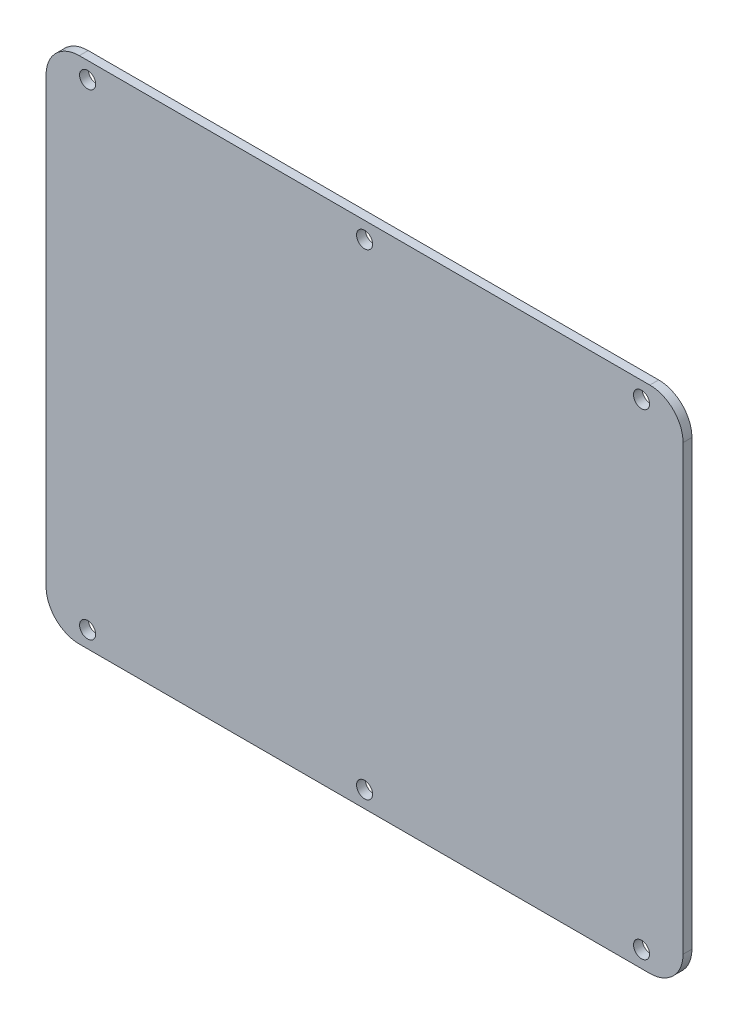
ISO-10303-21;
HEADER;
FILE_DESCRIPTION(('STEP AP214'),'2;1');
FILE_NAME('part.step','',(''),(''),'','','');
FILE_SCHEMA(('AUTOMOTIVE_DESIGN { 1 0 10303 214 1 1 1 1 }'));
ENDSEC;
DATA;
#1=APPLICATION_CONTEXT('core data for automotive mechanical design processes');
#2=APPLICATION_PROTOCOL_DEFINITION('international standard','automotive_design',2000,#1);
#3=PRODUCT_CONTEXT('',#1,'mechanical');
#4=PRODUCT('Part','Part','',(#3));
#5=PRODUCT_RELATED_PRODUCT_CATEGORY('part','',(#4));
#6=PRODUCT_DEFINITION_FORMATION('','',#4);
#7=PRODUCT_DEFINITION_CONTEXT('part definition',#1,'design');
#8=PRODUCT_DEFINITION('design','',#6,#7);
#9=PRODUCT_DEFINITION_SHAPE('','',#8);
#10=(LENGTH_UNIT() NAMED_UNIT(*) SI_UNIT(.MILLI.,.METRE.));
#11=(NAMED_UNIT(*) PLANE_ANGLE_UNIT() SI_UNIT($,.RADIAN.));
#12=(NAMED_UNIT(*) SI_UNIT($,.STERADIAN.) SOLID_ANGLE_UNIT());
#13=UNCERTAINTY_MEASURE_WITH_UNIT(LENGTH_MEASURE(1.E-05),#10,'distance_accuracy_value','');
#14=(GEOMETRIC_REPRESENTATION_CONTEXT(3) GLOBAL_UNCERTAINTY_ASSIGNED_CONTEXT((#13)) GLOBAL_UNIT_ASSIGNED_CONTEXT((#10,
#11,#12)) REPRESENTATION_CONTEXT('',''));
#15=CARTESIAN_POINT('',(0.,0.,0.));
#16=DIRECTION('',(0.,0.,1.));
#17=DIRECTION('',(1.,0.,0.));
#18=AXIS2_PLACEMENT_3D('',#15,#16,#17);
#19=CARTESIAN_POINT('',(57.5,46.,1.6002));
#20=DIRECTION('',(-1.,0.,0.));
#21=DIRECTION('',(0.,-1.,0.));
#22=AXIS2_PLACEMENT_3D('',#19,#20,#21);
#23=PLANE('',#22);
#24=DIRECTION('',(0.,1.,0.));
#25=VECTOR('',#24,1.);
#26=CARTESIAN_POINT('',(57.5,46.,1.6002));
#27=LINE('',#26,#25);
#28=CARTESIAN_POINT('',(57.5,-40.,1.6002));
#29=VERTEX_POINT('',#28);
#30=CARTESIAN_POINT('',(57.5,40.,1.6002));
#31=VERTEX_POINT('',#30);
#32=EDGE_CURVE('E119',#29,#31,#27,.T.);
#33=ORIENTED_EDGE('',*,*,#32,.F.);
#34=DIRECTION('',(0.,0.,-1.));
#35=VECTOR('',#34,1.);
#36=CARTESIAN_POINT('',(57.5,-40.,1.6002));
#37=LINE('',#36,#35);
#38=CARTESIAN_POINT('',(57.5,-40.,0.));
#39=VERTEX_POINT('',#38);
#40=EDGE_CURVE('E104',#29,#39,#37,.T.);
#41=ORIENTED_EDGE('',*,*,#40,.T.);
#42=DIRECTION('',(0.,1.,0.));
#43=VECTOR('',#42,1.);
#44=CARTESIAN_POINT('',(57.5,46.,0.));
#45=LINE('',#44,#43);
#46=CARTESIAN_POINT('',(57.5,40.,0.));
#47=VERTEX_POINT('',#46);
#48=EDGE_CURVE('E116',#39,#47,#45,.T.);
#49=ORIENTED_EDGE('',*,*,#48,.T.);
#50=DIRECTION('',(0.,0.,-1.));
#51=VECTOR('',#50,1.);
#52=CARTESIAN_POINT('',(57.5,40.,1.6002));
#53=LINE('',#52,#51);
#54=EDGE_CURVE('E121',#47,#31,#53,.F.);
#55=ORIENTED_EDGE('',*,*,#54,.T.);
#56=EDGE_LOOP('',(#33,#41,#49,#55));
#57=FACE_BOUND('',#56,.T.);
#58=ADVANCED_FACE('F33',(#57),#23,.F.);
#59=CARTESIAN_POINT('',(-57.5,46.,1.6002));
#60=DIRECTION('',(0.,-1.,0.));
#61=DIRECTION('',(0.,0.,-1.));
#62=AXIS2_PLACEMENT_3D('',#59,#60,#61);
#63=PLANE('',#62);
#64=DIRECTION('',(-1.,0.,0.));
#65=VECTOR('',#64,1.);
#66=CARTESIAN_POINT('',(-57.5,46.,1.6002));
#67=LINE('',#66,#65);
#68=CARTESIAN_POINT('',(51.5,46.,1.6002));
#69=VERTEX_POINT('',#68);
#70=CARTESIAN_POINT('',(-51.5,46.,1.6002));
#71=VERTEX_POINT('',#70);
#72=EDGE_CURVE('E163',#69,#71,#67,.T.);
#73=ORIENTED_EDGE('',*,*,#72,.F.);
#74=DIRECTION('',(0.,0.,-1.));
#75=VECTOR('',#74,1.);
#76=CARTESIAN_POINT('',(51.5,46.,1.6002));
#77=LINE('',#76,#75);
#78=CARTESIAN_POINT('',(51.5,46.,0.));
#79=VERTEX_POINT('',#78);
#80=EDGE_CURVE('E11',#69,#79,#77,.T.);
#81=ORIENTED_EDGE('',*,*,#80,.T.);
#82=DIRECTION('',(-1.,0.,0.));
#83=VECTOR('',#82,1.);
#84=CARTESIAN_POINT('',(-57.5,46.,0.));
#85=LINE('',#84,#83);
#86=CARTESIAN_POINT('',(-51.5,46.,0.));
#87=VERTEX_POINT('',#86);
#88=EDGE_CURVE('E126',#79,#87,#85,.T.);
#89=ORIENTED_EDGE('',*,*,#88,.T.);
#90=DIRECTION('',(0.,0.,-1.));
#91=VECTOR('',#90,1.);
#92=CARTESIAN_POINT('',(-51.5,46.,1.6002));
#93=LINE('',#92,#91);
#94=EDGE_CURVE('E41',#87,#71,#93,.F.);
#95=ORIENTED_EDGE('',*,*,#94,.T.);
#96=EDGE_LOOP('',(#73,#81,#89,#95));
#97=FACE_BOUND('',#96,.T.);
#98=ADVANCED_FACE('F162',(#97),#63,.F.);
#99=CARTESIAN_POINT('',(-57.5,46.,1.6002));
#100=DIRECTION('',(1.,0.,0.));
#101=DIRECTION('',(0.,1.,0.));
#102=AXIS2_PLACEMENT_3D('',#99,#100,#101);
#103=PLANE('',#102);
#104=DIRECTION('',(0.,-1.,0.));
#105=VECTOR('',#104,1.);
#106=CARTESIAN_POINT('',(-57.5,46.,0.));
#107=LINE('',#106,#105);
#108=CARTESIAN_POINT('',(-57.5,40.,0.));
#109=VERTEX_POINT('',#108);
#110=CARTESIAN_POINT('',(-57.5,-40.,0.));
#111=VERTEX_POINT('',#110);
#112=EDGE_CURVE('E130',#109,#111,#107,.T.);
#113=ORIENTED_EDGE('',*,*,#112,.T.);
#114=DIRECTION('',(0.,0.,-1.));
#115=VECTOR('',#114,1.);
#116=CARTESIAN_POINT('',(-57.5,-40.,1.6002));
#117=LINE('',#116,#115);
#118=CARTESIAN_POINT('',(-57.5,-40.,1.6002));
#119=VERTEX_POINT('',#118);
#120=EDGE_CURVE('E48',#111,#119,#117,.F.);
#121=ORIENTED_EDGE('',*,*,#120,.T.);
#122=DIRECTION('',(0.,-1.,0.));
#123=VECTOR('',#122,1.);
#124=CARTESIAN_POINT('',(-57.5,46.,1.6002));
#125=LINE('',#124,#123);
#126=CARTESIAN_POINT('',(-57.5,40.,1.6002));
#127=VERTEX_POINT('',#126);
#128=EDGE_CURVE('E169',#127,#119,#125,.T.);
#129=ORIENTED_EDGE('',*,*,#128,.F.);
#130=DIRECTION('',(0.,0.,-1.));
#131=VECTOR('',#130,1.);
#132=CARTESIAN_POINT('',(-57.5,40.,1.6002));
#133=LINE('',#132,#131);
#134=EDGE_CURVE('E156',#127,#109,#133,.T.);
#135=ORIENTED_EDGE('',*,*,#134,.T.);
#136=EDGE_LOOP('',(#113,#121,#129,#135));
#137=FACE_BOUND('',#136,.T.);
#138=ADVANCED_FACE('F173',(#137),#103,.F.);
#139=CARTESIAN_POINT('',(-57.5,-46.,1.6002));
#140=DIRECTION('',(0.,1.,0.));
#141=DIRECTION('',(0.,0.,1.));
#142=AXIS2_PLACEMENT_3D('',#139,#140,#141);
#143=PLANE('',#142);
#144=DIRECTION('',(1.,0.,0.));
#145=VECTOR('',#144,1.);
#146=CARTESIAN_POINT('',(-57.5,-46.,0.));
#147=LINE('',#146,#145);
#148=CARTESIAN_POINT('',(-51.5,-46.,0.));
#149=VERTEX_POINT('',#148);
#150=CARTESIAN_POINT('',(51.5,-46.,0.));
#151=VERTEX_POINT('',#150);
#152=EDGE_CURVE('E140',#149,#151,#147,.T.);
#153=ORIENTED_EDGE('',*,*,#152,.T.);
#154=DIRECTION('',(0.,0.,-1.));
#155=VECTOR('',#154,1.);
#156=CARTESIAN_POINT('',(51.5,-46.,1.6002));
#157=LINE('',#156,#155);
#158=CARTESIAN_POINT('',(51.5,-46.,1.6002));
#159=VERTEX_POINT('',#158);
#160=EDGE_CURVE('E105',#151,#159,#157,.F.);
#161=ORIENTED_EDGE('',*,*,#160,.T.);
#162=DIRECTION('',(1.,0.,0.));
#163=VECTOR('',#162,1.);
#164=CARTESIAN_POINT('',(-57.5,-46.,1.6002));
#165=LINE('',#164,#163);
#166=CARTESIAN_POINT('',(-51.5,-46.,1.6002));
#167=VERTEX_POINT('',#166);
#168=EDGE_CURVE('E136',#167,#159,#165,.T.);
#169=ORIENTED_EDGE('',*,*,#168,.F.);
#170=DIRECTION('',(0.,0.,-1.));
#171=VECTOR('',#170,1.);
#172=CARTESIAN_POINT('',(-51.5,-46.,1.6002));
#173=LINE('',#172,#171);
#174=EDGE_CURVE('E110',#167,#149,#173,.T.);
#175=ORIENTED_EDGE('',*,*,#174,.T.);
#176=EDGE_LOOP('',(#153,#161,#169,#175));
#177=FACE_BOUND('',#176,.T.);
#178=ADVANCED_FACE('F180',(#177),#143,.F.);
#179=CARTESIAN_POINT('',(0.,0.,1.6002));
#180=DIRECTION('',(0.,0.,1.));
#181=DIRECTION('',(1.,0.,0.));
#182=AXIS2_PLACEMENT_3D('',#179,#180,#181);
#183=PLANE('',#182);
#184=CARTESIAN_POINT('',(50.,-43.,1.6002));
#185=DIRECTION('',(0.,0.,1.));
#186=DIRECTION('',(1.,0.,0.));
#187=AXIS2_PLACEMENT_3D('',#184,#185,#186);
#188=CIRCLE('',#187,1.44999999999999);
#189=CARTESIAN_POINT('',(51.45,-43.,1.6002));
#190=VERTEX_POINT('',#189);
#191=EDGE_CURVE('E212',#190,#190,#188,.T.);
#192=ORIENTED_EDGE('',*,*,#191,.F.);
#193=EDGE_LOOP('',(#192));
#194=FACE_BOUND('',#193,.T.);
#195=CARTESIAN_POINT('',(-50.,43.,1.6002));
#196=DIRECTION('',(0.,0.,1.));
#197=DIRECTION('',(1.,0.,0.));
#198=AXIS2_PLACEMENT_3D('',#195,#196,#197);
#199=CIRCLE('',#198,1.44999999999999);
#200=CARTESIAN_POINT('',(-48.55,43.,1.6002));
#201=VERTEX_POINT('',#200);
#202=EDGE_CURVE('E206',#201,#201,#199,.T.);
#203=ORIENTED_EDGE('',*,*,#202,.F.);
#204=EDGE_LOOP('',(#203));
#205=FACE_BOUND('',#204,.T.);
#206=CARTESIAN_POINT('',(-50.,-43.,1.6002));
#207=DIRECTION('',(0.,0.,1.));
#208=DIRECTION('',(1.,0.,0.));
#209=AXIS2_PLACEMENT_3D('',#206,#207,#208);
#210=CIRCLE('',#209,1.44999999999999);
#211=CARTESIAN_POINT('',(-48.55,-43.,1.6002));
#212=VERTEX_POINT('',#211);
#213=EDGE_CURVE('E200',#212,#212,#210,.T.);
#214=ORIENTED_EDGE('',*,*,#213,.F.);
#215=EDGE_LOOP('',(#214));
#216=FACE_BOUND('',#215,.T.);
#217=CARTESIAN_POINT('',(50.,43.,1.6002));
#218=DIRECTION('',(0.,0.,1.));
#219=DIRECTION('',(1.,0.,0.));
#220=AXIS2_PLACEMENT_3D('',#217,#218,#219);
#221=CIRCLE('',#220,1.44999999999999);
#222=CARTESIAN_POINT('',(51.45,43.,1.6002));
#223=VERTEX_POINT('',#222);
#224=EDGE_CURVE('E194',#223,#223,#221,.T.);
#225=ORIENTED_EDGE('',*,*,#224,.F.);
#226=EDGE_LOOP('',(#225));
#227=FACE_BOUND('',#226,.T.);
#228=CARTESIAN_POINT('',(0.,43.,1.6002));
#229=DIRECTION('',(0.,0.,1.));
#230=DIRECTION('',(1.,0.,0.));
#231=AXIS2_PLACEMENT_3D('',#228,#229,#230);
#232=CIRCLE('',#231,1.44999999999999);
#233=CARTESIAN_POINT('',(1.44999999999999,43.,1.6002));
#234=VERTEX_POINT('',#233);
#235=EDGE_CURVE('E188',#234,#234,#232,.T.);
#236=ORIENTED_EDGE('',*,*,#235,.F.);
#237=EDGE_LOOP('',(#236));
#238=FACE_BOUND('',#237,.T.);
#239=CARTESIAN_POINT('',(0.,-43.,1.6002));
#240=DIRECTION('',(0.,0.,1.));
#241=DIRECTION('',(1.,0.,0.));
#242=AXIS2_PLACEMENT_3D('',#239,#240,#241);
#243=CIRCLE('',#242,1.44999999999999);
#244=CARTESIAN_POINT('',(1.44999999999999,-43.,1.6002));
#245=VERTEX_POINT('',#244);
#246=EDGE_CURVE('E133',#245,#245,#243,.T.);
#247=ORIENTED_EDGE('',*,*,#246,.F.);
#248=EDGE_LOOP('',(#247));
#249=FACE_BOUND('',#248,.T.);
#250=ORIENTED_EDGE('',*,*,#168,.T.);
#251=CARTESIAN_POINT('',(51.5,-40.,1.6002));
#252=DIRECTION('',(0.,0.,1.));
#253=DIRECTION('',(1.,0.,0.));
#254=AXIS2_PLACEMENT_3D('',#251,#252,#253);
#255=CIRCLE('',#254,6.);
#256=EDGE_CURVE('E154',#159,#29,#255,.T.);
#257=ORIENTED_EDGE('',*,*,#256,.T.);
#258=ORIENTED_EDGE('',*,*,#32,.T.);
#259=CARTESIAN_POINT('',(51.5,40.,1.6002));
#260=DIRECTION('',(0.,0.,1.));
#261=DIRECTION('',(1.,0.,0.));
#262=AXIS2_PLACEMENT_3D('',#259,#260,#261);
#263=CIRCLE('',#262,6.);
#264=EDGE_CURVE('E150',#31,#69,#263,.T.);
#265=ORIENTED_EDGE('',*,*,#264,.T.);
#266=ORIENTED_EDGE('',*,*,#72,.T.);
#267=CARTESIAN_POINT('',(-51.5,40.,1.6002));
#268=DIRECTION('',(0.,0.,1.));
#269=DIRECTION('',(1.,0.,0.));
#270=AXIS2_PLACEMENT_3D('',#267,#268,#269);
#271=CIRCLE('',#270,6.);
#272=EDGE_CURVE('E55',#71,#127,#271,.T.);
#273=ORIENTED_EDGE('',*,*,#272,.T.);
#274=ORIENTED_EDGE('',*,*,#128,.T.);
#275=CARTESIAN_POINT('',(-51.5,-40.,1.6002));
#276=DIRECTION('',(0.,0.,1.));
#277=DIRECTION('',(1.,0.,0.));
#278=AXIS2_PLACEMENT_3D('',#275,#276,#277);
#279=CIRCLE('',#278,6.);
#280=EDGE_CURVE('E152',#119,#167,#279,.T.);
#281=ORIENTED_EDGE('',*,*,#280,.T.);
#282=EDGE_LOOP('',(#250,#257,#258,#265,#266,#273,#274,#281));
#283=FACE_BOUND('',#282,.T.);
#284=ADVANCED_FACE('F167',(#194,#205,#216,#227,#238,#249,#283),#183,.T.);
#285=CARTESIAN_POINT('',(0.,0.,0.));
#286=DIRECTION('',(0.,0.,1.));
#287=DIRECTION('',(1.,0.,0.));
#288=AXIS2_PLACEMENT_3D('',#285,#286,#287);
#289=PLANE('',#288);
#290=CARTESIAN_POINT('',(50.,-43.,0.));
#291=DIRECTION('',(0.,0.,1.));
#292=DIRECTION('',(1.,0.,0.));
#293=AXIS2_PLACEMENT_3D('',#290,#291,#292);
#294=CIRCLE('',#293,1.44999999999999);
#295=CARTESIAN_POINT('',(51.45,-43.,0.));
#296=VERTEX_POINT('',#295);
#297=EDGE_CURVE('E209',#296,#296,#294,.T.);
#298=ORIENTED_EDGE('',*,*,#297,.T.);
#299=EDGE_LOOP('',(#298));
#300=FACE_BOUND('',#299,.T.);
#301=CARTESIAN_POINT('',(-50.,43.,0.));
#302=DIRECTION('',(0.,0.,1.));
#303=DIRECTION('',(1.,0.,0.));
#304=AXIS2_PLACEMENT_3D('',#301,#302,#303);
#305=CIRCLE('',#304,1.44999999999999);
#306=CARTESIAN_POINT('',(-48.55,43.,0.));
#307=VERTEX_POINT('',#306);
#308=EDGE_CURVE('E203',#307,#307,#305,.T.);
#309=ORIENTED_EDGE('',*,*,#308,.T.);
#310=EDGE_LOOP('',(#309));
#311=FACE_BOUND('',#310,.T.);
#312=CARTESIAN_POINT('',(-50.,-43.,0.));
#313=DIRECTION('',(0.,0.,1.));
#314=DIRECTION('',(1.,0.,0.));
#315=AXIS2_PLACEMENT_3D('',#312,#313,#314);
#316=CIRCLE('',#315,1.44999999999999);
#317=CARTESIAN_POINT('',(-48.55,-43.,0.));
#318=VERTEX_POINT('',#317);
#319=EDGE_CURVE('E197',#318,#318,#316,.T.);
#320=ORIENTED_EDGE('',*,*,#319,.T.);
#321=EDGE_LOOP('',(#320));
#322=FACE_BOUND('',#321,.T.);
#323=CARTESIAN_POINT('',(50.,43.,0.));
#324=DIRECTION('',(0.,0.,1.));
#325=DIRECTION('',(1.,0.,0.));
#326=AXIS2_PLACEMENT_3D('',#323,#324,#325);
#327=CIRCLE('',#326,1.44999999999999);
#328=CARTESIAN_POINT('',(51.45,43.,0.));
#329=VERTEX_POINT('',#328);
#330=EDGE_CURVE('E191',#329,#329,#327,.T.);
#331=ORIENTED_EDGE('',*,*,#330,.T.);
#332=EDGE_LOOP('',(#331));
#333=FACE_BOUND('',#332,.T.);
#334=CARTESIAN_POINT('',(0.,43.,0.));
#335=DIRECTION('',(0.,0.,1.));
#336=DIRECTION('',(1.,0.,0.));
#337=AXIS2_PLACEMENT_3D('',#334,#335,#336);
#338=CIRCLE('',#337,1.44999999999999);
#339=CARTESIAN_POINT('',(1.45,43.,0.));
#340=VERTEX_POINT('',#339);
#341=EDGE_CURVE('E185',#340,#340,#338,.T.);
#342=ORIENTED_EDGE('',*,*,#341,.T.);
#343=EDGE_LOOP('',(#342));
#344=FACE_BOUND('',#343,.T.);
#345=CARTESIAN_POINT('',(0.,-43.,0.));
#346=DIRECTION('',(0.,0.,1.));
#347=DIRECTION('',(1.,0.,0.));
#348=AXIS2_PLACEMENT_3D('',#345,#346,#347);
#349=CIRCLE('',#348,1.44999999999999);
#350=CARTESIAN_POINT('',(1.45,-43.,0.));
#351=VERTEX_POINT('',#350);
#352=EDGE_CURVE('E127',#351,#351,#349,.T.);
#353=ORIENTED_EDGE('',*,*,#352,.T.);
#354=EDGE_LOOP('',(#353));
#355=FACE_BOUND('',#354,.T.);
#356=ORIENTED_EDGE('',*,*,#48,.F.);
#357=CARTESIAN_POINT('',(51.5,-40.,0.));
#358=DIRECTION('',(0.,0.,1.));
#359=DIRECTION('',(1.,0.,0.));
#360=AXIS2_PLACEMENT_3D('',#357,#358,#359);
#361=CIRCLE('',#360,6.);
#362=EDGE_CURVE('E100',#39,#151,#361,.F.);
#363=ORIENTED_EDGE('',*,*,#362,.T.);
#364=ORIENTED_EDGE('',*,*,#152,.F.);
#365=CARTESIAN_POINT('',(-51.5,-40.,0.));
#366=DIRECTION('',(0.,0.,1.));
#367=DIRECTION('',(1.,0.,0.));
#368=AXIS2_PLACEMENT_3D('',#365,#366,#367);
#369=CIRCLE('',#368,6.);
#370=EDGE_CURVE('E111',#149,#111,#369,.F.);
#371=ORIENTED_EDGE('',*,*,#370,.T.);
#372=ORIENTED_EDGE('',*,*,#112,.F.);
#373=CARTESIAN_POINT('',(-51.5,40.,0.));
#374=DIRECTION('',(0.,0.,1.));
#375=DIRECTION('',(1.,0.,0.));
#376=AXIS2_PLACEMENT_3D('',#373,#374,#375);
#377=CIRCLE('',#376,6.);
#378=EDGE_CURVE('E120',#109,#87,#377,.F.);
#379=ORIENTED_EDGE('',*,*,#378,.T.);
#380=ORIENTED_EDGE('',*,*,#88,.F.);
#381=CARTESIAN_POINT('',(51.5,40.,0.));
#382=DIRECTION('',(0.,0.,1.));
#383=DIRECTION('',(1.,0.,0.));
#384=AXIS2_PLACEMENT_3D('',#381,#382,#383);
#385=CIRCLE('',#384,6.);
#386=EDGE_CURVE('E125',#79,#47,#385,.F.);
#387=ORIENTED_EDGE('',*,*,#386,.T.);
#388=EDGE_LOOP('',(#356,#363,#364,#371,#372,#379,#380,#387));
#389=FACE_BOUND('',#388,.T.);
#390=ADVANCED_FACE('F123',(#300,#311,#322,#333,#344,#355,#389),#289,.F.);
#391=CARTESIAN_POINT('',(0.,-43.,1.6002));
#392=DIRECTION('',(0.,0.,1.));
#393=DIRECTION('',(1.,0.,0.));
#394=AXIS2_PLACEMENT_3D('',#391,#392,#393);
#395=CYLINDRICAL_SURFACE('',#394,1.44999999999999);
#396=ORIENTED_EDGE('',*,*,#352,.F.);
#397=EDGE_LOOP('',(#396));
#398=FACE_BOUND('',#397,.T.);
#399=ORIENTED_EDGE('',*,*,#246,.T.);
#400=EDGE_LOOP('',(#399));
#401=FACE_BOUND('',#400,.T.);
#402=ADVANCED_FACE('F231',(#398,#401),#395,.F.);
#403=CARTESIAN_POINT('',(0.,43.,1.6002));
#404=DIRECTION('',(0.,0.,1.));
#405=DIRECTION('',(1.,0.,0.));
#406=AXIS2_PLACEMENT_3D('',#403,#404,#405);
#407=CYLINDRICAL_SURFACE('',#406,1.44999999999999);
#408=ORIENTED_EDGE('',*,*,#341,.F.);
#409=EDGE_LOOP('',(#408));
#410=FACE_BOUND('',#409,.T.);
#411=ORIENTED_EDGE('',*,*,#235,.T.);
#412=EDGE_LOOP('',(#411));
#413=FACE_BOUND('',#412,.T.);
#414=ADVANCED_FACE('F233',(#410,#413),#407,.F.);
#415=CARTESIAN_POINT('',(50.,43.,1.6002));
#416=DIRECTION('',(0.,0.,1.));
#417=DIRECTION('',(1.,0.,0.));
#418=AXIS2_PLACEMENT_3D('',#415,#416,#417);
#419=CYLINDRICAL_SURFACE('',#418,1.44999999999999);
#420=ORIENTED_EDGE('',*,*,#330,.F.);
#421=EDGE_LOOP('',(#420));
#422=FACE_BOUND('',#421,.T.);
#423=ORIENTED_EDGE('',*,*,#224,.T.);
#424=EDGE_LOOP('',(#423));
#425=FACE_BOUND('',#424,.T.);
#426=ADVANCED_FACE('F240',(#422,#425),#419,.F.);
#427=CARTESIAN_POINT('',(-50.,-43.,1.6002));
#428=DIRECTION('',(0.,0.,1.));
#429=DIRECTION('',(1.,0.,0.));
#430=AXIS2_PLACEMENT_3D('',#427,#428,#429);
#431=CYLINDRICAL_SURFACE('',#430,1.44999999999999);
#432=ORIENTED_EDGE('',*,*,#319,.F.);
#433=EDGE_LOOP('',(#432));
#434=FACE_BOUND('',#433,.T.);
#435=ORIENTED_EDGE('',*,*,#213,.T.);
#436=EDGE_LOOP('',(#435));
#437=FACE_BOUND('',#436,.T.);
#438=ADVANCED_FACE('F338',(#434,#437),#431,.F.);
#439=CARTESIAN_POINT('',(-50.,43.,1.6002));
#440=DIRECTION('',(0.,0.,1.));
#441=DIRECTION('',(1.,0.,0.));
#442=AXIS2_PLACEMENT_3D('',#439,#440,#441);
#443=CYLINDRICAL_SURFACE('',#442,1.44999999999999);
#444=ORIENTED_EDGE('',*,*,#308,.F.);
#445=EDGE_LOOP('',(#444));
#446=FACE_BOUND('',#445,.T.);
#447=ORIENTED_EDGE('',*,*,#202,.T.);
#448=EDGE_LOOP('',(#447));
#449=FACE_BOUND('',#448,.T.);
#450=ADVANCED_FACE('F328',(#446,#449),#443,.F.);
#451=CARTESIAN_POINT('',(50.,-43.,1.6002));
#452=DIRECTION('',(0.,0.,1.));
#453=DIRECTION('',(1.,0.,0.));
#454=AXIS2_PLACEMENT_3D('',#451,#452,#453);
#455=CYLINDRICAL_SURFACE('',#454,1.44999999999999);
#456=ORIENTED_EDGE('',*,*,#297,.F.);
#457=EDGE_LOOP('',(#456));
#458=FACE_BOUND('',#457,.T.);
#459=ORIENTED_EDGE('',*,*,#191,.T.);
#460=EDGE_LOOP('',(#459));
#461=FACE_BOUND('',#460,.T.);
#462=ADVANCED_FACE('F216',(#458,#461),#455,.F.);
#463=CARTESIAN_POINT('',(51.5,-40.,1.6002));
#464=DIRECTION('',(0.,0.,-1.));
#465=DIRECTION('',(-1.,0.,0.));
#466=AXIS2_PLACEMENT_3D('',#463,#464,#465);
#467=CYLINDRICAL_SURFACE('',#466,6.);
#468=ORIENTED_EDGE('',*,*,#256,.F.);
#469=ORIENTED_EDGE('',*,*,#160,.F.);
#470=ORIENTED_EDGE('',*,*,#362,.F.);
#471=ORIENTED_EDGE('',*,*,#40,.F.);
#472=EDGE_LOOP('',(#468,#469,#470,#471));
#473=FACE_BOUND('',#472,.T.);
#474=ADVANCED_FACE('F103',(#473),#467,.T.);
#475=CARTESIAN_POINT('',(-51.5,-40.,1.6002));
#476=DIRECTION('',(0.,0.,-1.));
#477=DIRECTION('',(-1.,0.,0.));
#478=AXIS2_PLACEMENT_3D('',#475,#476,#477);
#479=CYLINDRICAL_SURFACE('',#478,6.);
#480=ORIENTED_EDGE('',*,*,#280,.F.);
#481=ORIENTED_EDGE('',*,*,#120,.F.);
#482=ORIENTED_EDGE('',*,*,#370,.F.);
#483=ORIENTED_EDGE('',*,*,#174,.F.);
#484=EDGE_LOOP('',(#480,#481,#482,#483));
#485=FACE_BOUND('',#484,.T.);
#486=ADVANCED_FACE('F177',(#485),#479,.T.);
#487=CARTESIAN_POINT('',(51.5,40.,1.6002));
#488=DIRECTION('',(0.,0.,-1.));
#489=DIRECTION('',(-1.,0.,0.));
#490=AXIS2_PLACEMENT_3D('',#487,#488,#489);
#491=CYLINDRICAL_SURFACE('',#490,6.);
#492=ORIENTED_EDGE('',*,*,#264,.F.);
#493=ORIENTED_EDGE('',*,*,#54,.F.);
#494=ORIENTED_EDGE('',*,*,#386,.F.);
#495=ORIENTED_EDGE('',*,*,#80,.F.);
#496=EDGE_LOOP('',(#492,#493,#494,#495));
#497=FACE_BOUND('',#496,.T.);
#498=ADVANCED_FACE('F257',(#497),#491,.T.);
#499=CARTESIAN_POINT('',(-51.5,40.,1.6002));
#500=DIRECTION('',(0.,0.,-1.));
#501=DIRECTION('',(-1.,0.,0.));
#502=AXIS2_PLACEMENT_3D('',#499,#500,#501);
#503=CYLINDRICAL_SURFACE('',#502,6.);
#504=ORIENTED_EDGE('',*,*,#272,.F.);
#505=ORIENTED_EDGE('',*,*,#94,.F.);
#506=ORIENTED_EDGE('',*,*,#378,.F.);
#507=ORIENTED_EDGE('',*,*,#134,.F.);
#508=EDGE_LOOP('',(#504,#505,#506,#507));
#509=FACE_BOUND('',#508,.T.);
#510=ADVANCED_FACE('F35',(#509),#503,.T.);
#511=CLOSED_SHELL('',(#58,#98,#138,#178,#284,#390,#402,#414,#426,#438,#450,#462,#474,#486,#498,#510));
#512=MANIFOLD_SOLID_BREP('B2',#511);
#513=ADVANCED_BREP_SHAPE_REPRESENTATION('',(#18,#512),#14);
#514=SHAPE_DEFINITION_REPRESENTATION(#9,#513);
ENDSEC;
END-ISO-10303-21;
